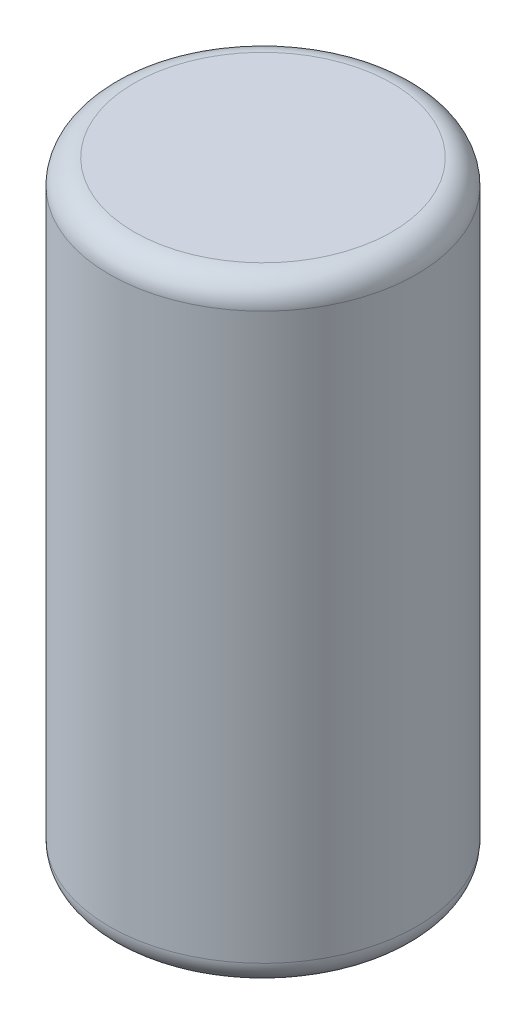
ISO-10303-21;
HEADER;
FILE_DESCRIPTION(('STEP AP214'),'2;1');
FILE_NAME('part.step','',(''),(''),'','','');
FILE_SCHEMA(('AUTOMOTIVE_DESIGN { 1 0 10303 214 1 1 1 1 }'));
ENDSEC;
DATA;
#1=APPLICATION_CONTEXT('core data for automotive mechanical design processes');
#2=APPLICATION_PROTOCOL_DEFINITION('international standard','automotive_design',2000,#1);
#3=PRODUCT_CONTEXT('',#1,'mechanical');
#4=PRODUCT('Part','Part','',(#3));
#5=PRODUCT_RELATED_PRODUCT_CATEGORY('part','',(#4));
#6=PRODUCT_DEFINITION_FORMATION('','',#4);
#7=PRODUCT_DEFINITION_CONTEXT('part definition',#1,'design');
#8=PRODUCT_DEFINITION('design','',#6,#7);
#9=PRODUCT_DEFINITION_SHAPE('','',#8);
#10=(LENGTH_UNIT() NAMED_UNIT(*) SI_UNIT(.MILLI.,.METRE.));
#11=(NAMED_UNIT(*) PLANE_ANGLE_UNIT() SI_UNIT($,.RADIAN.));
#12=(NAMED_UNIT(*) SI_UNIT($,.STERADIAN.) SOLID_ANGLE_UNIT());
#13=UNCERTAINTY_MEASURE_WITH_UNIT(LENGTH_MEASURE(1.E-05),#10,'distance_accuracy_value','');
#14=(GEOMETRIC_REPRESENTATION_CONTEXT(3) GLOBAL_UNCERTAINTY_ASSIGNED_CONTEXT((#13)) GLOBAL_UNIT_ASSIGNED_CONTEXT((#10,
#11,#12)) REPRESENTATION_CONTEXT('',''));
#15=CARTESIAN_POINT('',(0.,0.,0.));
#16=DIRECTION('',(0.,0.,1.));
#17=DIRECTION('',(1.,0.,0.));
#18=AXIS2_PLACEMENT_3D('',#15,#16,#17);
#19=CARTESIAN_POINT('',(0.,250.,0.));
#20=DIRECTION('',(0.,-1.,0.));
#21=DIRECTION('',(0.,0.,-1.));
#22=AXIS2_PLACEMENT_3D('',#19,#20,#21);
#23=CYLINDRICAL_SURFACE('',#22,62.5);
#24=CARTESIAN_POINT('',(0.,10.,0.));
#25=DIRECTION('',(0.,1.,0.));
#26=DIRECTION('',(0.,0.,1.));
#27=AXIS2_PLACEMENT_3D('',#24,#25,#26);
#28=CIRCLE('',#27,62.5);
#29=CARTESIAN_POINT('',(0.,10.,62.5));
#30=VERTEX_POINT('',#29);
#31=EDGE_CURVE('E42',#30,#30,#28,.T.);
#32=ORIENTED_EDGE('',*,*,#31,.T.);
#33=EDGE_LOOP('',(#32));
#34=FACE_BOUND('',#33,.T.);
#35=CARTESIAN_POINT('',(0.,240.,0.));
#36=DIRECTION('',(0.,1.,0.));
#37=DIRECTION('',(0.,0.,1.));
#38=AXIS2_PLACEMENT_3D('',#35,#36,#37);
#39=CIRCLE('',#38,62.5);
#40=CARTESIAN_POINT('',(0.,240.,62.5));
#41=VERTEX_POINT('',#40);
#42=EDGE_CURVE('E46',#41,#41,#39,.F.);
#43=ORIENTED_EDGE('',*,*,#42,.T.);
#44=EDGE_LOOP('',(#43));
#45=FACE_BOUND('',#44,.T.);
#46=ADVANCED_FACE('F31',(#34,#45),#23,.T.);
#47=CARTESIAN_POINT('',(0.,250.,0.));
#48=DIRECTION('',(0.,1.,0.));
#49=DIRECTION('',(0.,0.,1.));
#50=AXIS2_PLACEMENT_3D('',#47,#48,#49);
#51=PLANE('',#50);
#52=CARTESIAN_POINT('',(0.,250.,0.));
#53=DIRECTION('',(0.,1.,0.));
#54=DIRECTION('',(0.,0.,1.));
#55=AXIS2_PLACEMENT_3D('',#52,#53,#54);
#56=CIRCLE('',#55,52.5);
#57=CARTESIAN_POINT('',(0.,250.,52.5));
#58=VERTEX_POINT('',#57);
#59=EDGE_CURVE('E10',#58,#58,#56,.T.);
#60=ORIENTED_EDGE('',*,*,#59,.T.);
#61=EDGE_LOOP('',(#60));
#62=FACE_BOUND('',#61,.T.);
#63=ADVANCED_FACE('F62',(#62),#51,.T.);
#64=CARTESIAN_POINT('',(0.,0.,0.));
#65=DIRECTION('',(0.,1.,0.));
#66=DIRECTION('',(0.,0.,1.));
#67=AXIS2_PLACEMENT_3D('',#64,#65,#66);
#68=PLANE('',#67);
#69=CARTESIAN_POINT('',(0.,0.,0.));
#70=DIRECTION('',(0.,1.,0.));
#71=DIRECTION('',(0.,0.,1.));
#72=AXIS2_PLACEMENT_3D('',#69,#70,#71);
#73=CIRCLE('',#72,52.5);
#74=CARTESIAN_POINT('',(0.,0.,52.5));
#75=VERTEX_POINT('',#74);
#76=EDGE_CURVE('E38',#75,#75,#73,.F.);
#77=ORIENTED_EDGE('',*,*,#76,.T.);
#78=EDGE_LOOP('',(#77));
#79=FACE_BOUND('',#78,.T.);
#80=ADVANCED_FACE('F59',(#79),#68,.F.);
#81=CARTESIAN_POINT('',(0.,10.,0.));
#82=DIRECTION('',(0.,1.,0.));
#83=DIRECTION('',(0.,0.,1.));
#84=AXIS2_PLACEMENT_3D('',#81,#82,#83);
#85=TOROIDAL_SURFACE('',#84,52.5,10.);
#86=ORIENTED_EDGE('',*,*,#76,.F.);
#87=EDGE_LOOP('',(#86));
#88=FACE_BOUND('',#87,.T.);
#89=ORIENTED_EDGE('',*,*,#31,.F.);
#90=EDGE_LOOP('',(#89));
#91=FACE_BOUND('',#90,.T.);
#92=ADVANCED_FACE('F55',(#88,#91),#85,.T.);
#93=CARTESIAN_POINT('',(0.,240.,0.));
#94=DIRECTION('',(0.,1.,0.));
#95=DIRECTION('',(0.,0.,1.));
#96=AXIS2_PLACEMENT_3D('',#93,#94,#95);
#97=TOROIDAL_SURFACE('',#96,52.5,10.);
#98=ORIENTED_EDGE('',*,*,#42,.F.);
#99=EDGE_LOOP('',(#98));
#100=FACE_BOUND('',#99,.T.);
#101=ORIENTED_EDGE('',*,*,#59,.F.);
#102=EDGE_LOOP('',(#101));
#103=FACE_BOUND('',#102,.T.);
#104=ADVANCED_FACE('F33',(#100,#103),#97,.T.);
#105=CLOSED_SHELL('',(#46,#63,#80,#92,#104));
#106=MANIFOLD_SOLID_BREP('B2',#105);
#107=ADVANCED_BREP_SHAPE_REPRESENTATION('',(#18,#106),#14);
#108=SHAPE_DEFINITION_REPRESENTATION(#9,#107);
ENDSEC;
END-ISO-10303-21;
